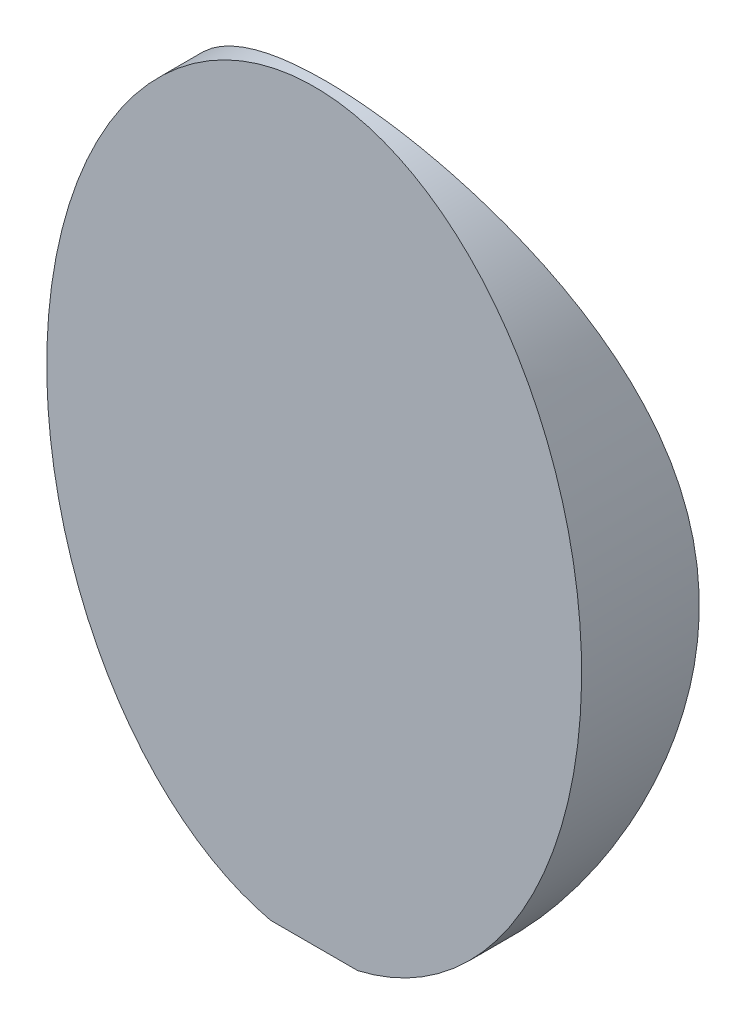
ISO-10303-21;
HEADER;
FILE_DESCRIPTION(('STEP AP214'),'2;1');
FILE_NAME('part.step','',(''),(''),'','','');
FILE_SCHEMA(('AUTOMOTIVE_DESIGN { 1 0 10303 214 1 1 1 1 }'));
ENDSEC;
DATA;
#1=APPLICATION_CONTEXT('core data for automotive mechanical design processes');
#2=APPLICATION_PROTOCOL_DEFINITION('international standard','automotive_design',2000,#1);
#3=PRODUCT_CONTEXT('',#1,'mechanical');
#4=PRODUCT('Part','Part','',(#3));
#5=PRODUCT_RELATED_PRODUCT_CATEGORY('part','',(#4));
#6=PRODUCT_DEFINITION_FORMATION('','',#4);
#7=PRODUCT_DEFINITION_CONTEXT('part definition',#1,'design');
#8=PRODUCT_DEFINITION('design','',#6,#7);
#9=PRODUCT_DEFINITION_SHAPE('','',#8);
#10=(LENGTH_UNIT() NAMED_UNIT(*) SI_UNIT(.MILLI.,.METRE.));
#11=(NAMED_UNIT(*) PLANE_ANGLE_UNIT() SI_UNIT($,.RADIAN.));
#12=(NAMED_UNIT(*) SI_UNIT($,.STERADIAN.) SOLID_ANGLE_UNIT());
#13=UNCERTAINTY_MEASURE_WITH_UNIT(LENGTH_MEASURE(1.E-05),#10,'distance_accuracy_value','');
#14=(GEOMETRIC_REPRESENTATION_CONTEXT(3) GLOBAL_UNCERTAINTY_ASSIGNED_CONTEXT((#13)) GLOBAL_UNIT_ASSIGNED_CONTEXT((#10,
#11,#12)) REPRESENTATION_CONTEXT('',''));
#15=CARTESIAN_POINT('',(0.,0.,0.));
#16=DIRECTION('',(0.,0.,1.));
#17=DIRECTION('',(1.,0.,0.));
#18=AXIS2_PLACEMENT_3D('',#15,#16,#17);
#19=CARTESIAN_POINT('',(0.,0.,0.4));
#20=DIRECTION('',(0.,0.,1.));
#21=DIRECTION('',(0.,1.,0.));
#22=AXIS2_PLACEMENT_3D('',#19,#20,#21);
#23=ELLIPSE('',#22,0.7,0.5);
#24=DIRECTION('',(0.,0.,-1.));
#25=VECTOR('',#24,1.);
#26=SURFACE_OF_LINEAR_EXTRUSION('',#23,#25);
#27=DIRECTION('',(0.,0.,-1.));
#28=VECTOR('',#27,1.);
#29=CARTESIAN_POINT('',(0.0814909660568855,-0.690640337660773,0.4));
#30=LINE('',#29,#28);
#31=CARTESIAN_POINT('',(0.0814909660568855,-0.690640337660773,0.4));
#32=VERTEX_POINT('',#31);
#33=CARTESIAN_POINT('',(0.0814909660568855,-0.690640337660773,0.375405595793866));
#34=VERTEX_POINT('',#33);
#35=EDGE_CURVE('E49',#32,#34,#30,.T.);
#36=ORIENTED_EDGE('',*,*,#35,.T.);
#37=CARTESIAN_POINT('',(0.0814909660568853,-0.690640337660773,0.375405595793866));
#38=CARTESIAN_POINT('',(0.103783857965599,-0.685503867180913,0.372897240989533));
#39=CARTESIAN_POINT('',(0.125357213632184,-0.678326748241472,0.369397071177329));
#40=CARTESIAN_POINT('',(0.166582420436828,-0.6606847828203,0.360909722843765));
#41=CARTESIAN_POINT('',(0.186249843571142,-0.650250164964634,0.355936237103313));
#42=CARTESIAN_POINT('',(0.22887583197769,-0.623446553073999,0.343381166370401));
#43=CARTESIAN_POINT('',(0.251191271496423,-0.606233831020013,0.335459794318096));
#44=CARTESIAN_POINT('',(0.297684870257633,-0.564062746469057,0.316652597742075));
#45=CARTESIAN_POINT('',(0.320963247320527,-0.538241212492799,0.305517666158957));
#46=CARTESIAN_POINT('',(0.362863556927269,-0.483260901695331,0.283106947997824));
#47=CARTESIAN_POINT('',(0.38149171231684,-0.454106661689654,0.271831371088963));
#48=CARTESIAN_POINT('',(0.414538443906358,-0.393253086741299,0.250124070084093));
#49=CARTESIAN_POINT('',(0.428959264261966,-0.361555120147341,0.23969189827779));
#50=CARTESIAN_POINT('',(0.45382664469489,-0.296130607545836,0.220607644862353));
#51=CARTESIAN_POINT('',(0.464273383360247,-0.262404152773777,0.211955483270806));
#52=CARTESIAN_POINT('',(0.481342088482892,-0.192997251501918,0.197276712710825));
#53=CARTESIAN_POINT('',(0.487918639503869,-0.157298780230547,0.19128147587567));
#54=CARTESIAN_POINT('',(0.496993890713454,-0.0849752885129556,0.182883599243802));
#55=CARTESIAN_POINT('',(0.499494395364313,-0.0483506853608524,0.180479369750688));
#56=CARTESIAN_POINT('',(0.500418497746685,0.0293734420000617,0.179603827445172));
#57=CARTESIAN_POINT('',(0.498321571440296,0.0704868748823529,0.181634541820555));
#58=CARTESIAN_POINT('',(0.489016886643434,0.151591997118906,0.190280130539605));
#59=CARTESIAN_POINT('',(0.481810995186069,0.191584090709826,0.196893330228281));
#60=CARTESIAN_POINT('',(0.462388418320221,0.269540008140132,0.213555427707114));
#61=CARTESIAN_POINT('',(0.450173970770568,0.307504729272708,0.223602790755123));
#62=CARTESIAN_POINT('',(0.420643489773036,0.38074436999057,0.245783663534853));
#63=CARTESIAN_POINT('',(0.403327651117409,0.416019392214976,0.257917093604526));
#64=CARTESIAN_POINT('',(0.36423206397941,0.481351759849966,0.282267204825226));
#65=CARTESIAN_POINT('',(0.34272648098127,0.511583835764477,0.294447769504633));
#66=CARTESIAN_POINT('',(0.298956077656205,0.562209553010518,0.315849002088011));
#67=CARTESIAN_POINT('',(0.277653243988023,0.583372924022462,0.325184429220821));
#68=CARTESIAN_POINT('',(0.234962351036348,0.618707628139722,0.341186030919244));
#69=CARTESIAN_POINT('',(0.214129853270972,0.63345579049349,0.348040454833732));
#70=CARTESIAN_POINT('',(0.169841488373401,0.659227234784341,0.360196300218022));
#71=CARTESIAN_POINT('',(0.14639056802111,0.670257387509142,0.365500583867115));
#72=CARTESIAN_POINT('',(0.104471203401554,0.685012668395196,0.372651766187296));
#73=CARTESIAN_POINT('',(0.0865161494572833,0.689927117279259,0.3750545846767));
#74=CARTESIAN_POINT('',(0.0499446251320589,0.696976549027224,0.378509913085898));
#75=CARTESIAN_POINT('',(0.0313288157981936,0.699114233609242,0.379563735528595));
#76=CARTESIAN_POINT('',(-0.0060759066415551,0.700439299878458,0.380216348599396));
#77=CARTESIAN_POINT('',(-0.0248651116473979,0.69962014240914,0.379811914245278));
#78=CARTESIAN_POINT('',(-0.0620055286467877,0.695087298138192,0.377583502445104));
#79=CARTESIAN_POINT('',(-0.0803565311921573,0.691372254639459,0.37575885964449));
#80=CARTESIAN_POINT('',(-0.115789842997176,0.681432301006926,0.370913232895973));
#81=CARTESIAN_POINT('',(-0.132889966464227,0.675257999541098,0.367916392512843));
#82=CARTESIAN_POINT('',(-0.165965622542594,0.660759689993982,0.360951233543344));
#83=CARTESIAN_POINT('',(-0.181938741818941,0.65243123687303,0.356980907084214));
#84=CARTESIAN_POINT('',(-0.22121245565506,0.628822576143697,0.345875556532323));
#85=CARTESIAN_POINT('',(-0.243596490019038,0.612263618028453,0.338214706261084));
#86=CARTESIAN_POINT('',(-0.28519606958932,0.575987927278807,0.321925447738972));
#87=CARTESIAN_POINT('',(-0.304406285192339,0.55626599049429,0.313295452061187));
#88=CARTESIAN_POINT('',(-0.347673040755996,0.505241915974104,0.291837360855498));
#89=CARTESIAN_POINT('',(-0.370137074882206,0.472665432523722,0.278834500267154));
#90=CARTESIAN_POINT('',(-0.409520688838029,0.404022764809992,0.253717653716019));
#91=CARTESIAN_POINT('',(-0.426432659795866,0.367951878508431,0.241604905102425));
#92=CARTESIAN_POINT('',(-0.455458174049558,0.292084176418072,0.219381107416788));
#93=CARTESIAN_POINT('',(-0.46742460172488,0.25221146275341,0.209335369439705));
#94=CARTESIAN_POINT('',(-0.485911399663204,0.170464447659873,0.19320774848431));
#95=CARTESIAN_POINT('',(-0.492436918009739,0.128592078028535,0.187122119726999));
#96=CARTESIAN_POINT('',(-0.500052269132576,0.042677095510298,0.179980255621956));
#97=CARTESIAN_POINT('',(-0.500980146785784,-0.00139328997805121,0.179073909703364));
#98=CARTESIAN_POINT('',(-0.496932019567044,-0.089026659062811,0.182910551207332));
#99=CARTESIAN_POINT('',(-0.491952320277483,-0.132589307924751,0.187657073767866));
#100=CARTESIAN_POINT('',(-0.476826447597069,-0.214524022281713,0.201216871076895));
#101=CARTESIAN_POINT('',(-0.46711086473264,-0.253036636242348,0.209686237718503));
#102=CARTESIAN_POINT('',(-0.442767174869421,-0.327789526033034,0.229305326860279));
#103=CARTESIAN_POINT('',(-0.428135125978376,-0.364027950721571,0.240457198076679));
#104=CARTESIAN_POINT('',(-0.394891294326582,-0.431181177770067,0.263330612630065));
#105=CARTESIAN_POINT('',(-0.376610649348078,-0.462289893540874,0.274964339597056));
#106=CARTESIAN_POINT('',(-0.335171755178364,-0.521070159887526,0.298311485277892));
#107=CARTESIAN_POINT('',(-0.312021115516763,-0.548746966935158,0.310024752394591));
#108=CARTESIAN_POINT('',(-0.269517024936661,-0.590286596747227,0.328287019632697));
#109=CARTESIAN_POINT('',(-0.25171270367995,-0.605574802402187,0.335198248778786));
#110=CARTESIAN_POINT('',(-0.213840367370048,-0.633453168015928,0.348031653711258));
#111=CARTESIAN_POINT('',(-0.19378166563811,-0.646053847363463,0.353957664914376));
#112=CARTESIAN_POINT('',(-0.144118882267653,-0.671648984828261,0.366143390018946));
#113=CARTESIAN_POINT('',(-0.113640546694371,-0.683220099863175,0.371786003508301));
#114=CARTESIAN_POINT('',(-0.081490966056886,-0.690640337660773,0.375405595793866));
#115=B_SPLINE_CURVE_WITH_KNOTS('',3,(#37,#38,#39,#40,#41,#42,#43,#44,#45,#46,#47,#48,#49,#50,
#51,#52,#53,#54,#55,#56,#57,#58,#59,#60,#61,#62,#63,#64,#65,#66,#67,#68,#69,#70,#71,#72,#73,#74,
#75,#76,#77,#78,#79,#80,#81,#82,#83,#84,#85,#86,#87,#88,#89,#90,#91,#92,#93,#94,#95,#96,#97,#98,
#99,#100,#101,#102,#103,#104,#105,#106,#107,#108,#109,#110,#111,#112,#113,#114),.UNSPECIFIED.,
.F.,.F.,(4,2,2,2,2,2,2,2,2,2,2,2,2,2,2,2,2,2,2,2,2,2,2,2,2,2,2,2,2,2,2,2,2,2,2,2,2,2,4),(0.,
0.0687272270019127,0.136834747800037,0.224211264465825,0.333154812622203,0.44195178335059,
0.550690616186545,0.65942456191863,0.769410257987003,0.879347250245141,1.0023658614198,
1.12533953951956,1.24825833186399,1.37117243126779,1.48778897652579,1.58171397691671,
1.6606576856038,1.73945469810226,1.79552834513752,1.85154739303183,1.90769040477987,
1.96385973485426,2.01892839754204,2.07411161244408,2.16025364094591,2.24653888382911,
2.37083103782041,2.49529282479597,2.62322872210764,2.75104343112819,2.88253909056358,
3.01411702672295,3.13549148086101,3.2569634829596,3.37032115847212,3.48350300728094,
3.55668876276169,3.62958257593838,3.72814084618367),.UNSPECIFIED.);
#116=CARTESIAN_POINT('',(-0.0814909660568858,-0.690640337660773,0.375405595793866));
#117=VERTEX_POINT('',#116);
#118=EDGE_CURVE('E55',#34,#117,#115,.T.);
#119=ORIENTED_EDGE('',*,*,#118,.T.);
#120=DIRECTION('',(0.,0.,-1.));
#121=VECTOR('',#120,1.);
#122=CARTESIAN_POINT('',(-0.0814909660568858,-0.690640337660773,0.4));
#123=LINE('',#122,#121);
#124=CARTESIAN_POINT('',(-0.0814909660568858,-0.690640337660773,0.4));
#125=VERTEX_POINT('',#124);
#126=EDGE_CURVE('E11',#125,#117,#123,.T.);
#127=ORIENTED_EDGE('',*,*,#126,.F.);
#128=EDGE_CURVE('E72',#32,#125,#23,.T.);
#129=ORIENTED_EDGE('',*,*,#128,.F.);
#130=EDGE_LOOP('',(#36,#119,#127,#129));
#131=FACE_BOUND('',#130,.T.);
#132=ADVANCED_FACE('F39',(#131),#26,.F.);
#133=CARTESIAN_POINT('',(-0.0814909660568858,-0.690640337660773,0.4));
#134=DIRECTION('',(0.,1.,0.));
#135=DIRECTION('',(0.,0.,1.));
#136=AXIS2_PLACEMENT_3D('',#133,#134,#135);
#137=PLANE('',#136);
#138=ORIENTED_EDGE('',*,*,#126,.T.);
#139=CARTESIAN_POINT('',(0.,-0.690640337660773,-0.345));
#140=DIRECTION('',(0.,1.,0.));
#141=DIRECTION('',(0.,0.,1.));
#142=AXIS2_PLACEMENT_3D('',#139,#140,#141);
#143=CIRCLE('',#142,0.725);
#144=EDGE_CURVE('E73',#117,#34,#143,.T.);
#145=ORIENTED_EDGE('',*,*,#144,.T.);
#146=ORIENTED_EDGE('',*,*,#35,.F.);
#147=DIRECTION('',(1.,0.,0.));
#148=VECTOR('',#147,1.);
#149=CARTESIAN_POINT('',(-0.0814909660568858,-0.690640337660773,0.4));
#150=LINE('',#149,#148);
#151=EDGE_CURVE('E62',#125,#32,#150,.T.);
#152=ORIENTED_EDGE('',*,*,#151,.F.);
#153=EDGE_LOOP('',(#138,#145,#146,#152));
#154=FACE_BOUND('',#153,.T.);
#155=ADVANCED_FACE('F79',(#154),#137,.F.);
#156=CARTESIAN_POINT('',(0.,0.,0.4));
#157=DIRECTION('',(0.,0.,1.));
#158=DIRECTION('',(1.,0.,0.));
#159=AXIS2_PLACEMENT_3D('',#156,#157,#158);
#160=PLANE('',#159);
#161=ORIENTED_EDGE('',*,*,#128,.T.);
#162=ORIENTED_EDGE('',*,*,#151,.T.);
#163=EDGE_LOOP('',(#161,#162));
#164=FACE_BOUND('',#163,.T.);
#165=ADVANCED_FACE('F82',(#164),#160,.T.);
#166=CARTESIAN_POINT('',(0.,-0.690640337660773,-0.345));
#167=DIRECTION('',(0.,1.,0.));
#168=DIRECTION('',(0.,0.,1.));
#169=AXIS2_PLACEMENT_3D('',#166,#167,#168);
#170=CYLINDRICAL_SURFACE('',#169,0.725);
#171=ORIENTED_EDGE('',*,*,#144,.F.);
#172=ORIENTED_EDGE('',*,*,#118,.F.);
#173=EDGE_LOOP('',(#171,#172));
#174=FACE_BOUND('',#173,.T.);
#175=ADVANCED_FACE('F75',(#174),#170,.F.);
#176=CLOSED_SHELL('',(#132,#155,#165,#175));
#177=MANIFOLD_SOLID_BREP('B2',#176);
#178=ADVANCED_BREP_SHAPE_REPRESENTATION('',(#18,#177),#14);
#179=SHAPE_DEFINITION_REPRESENTATION(#9,#178);
ENDSEC;
END-ISO-10303-21;
